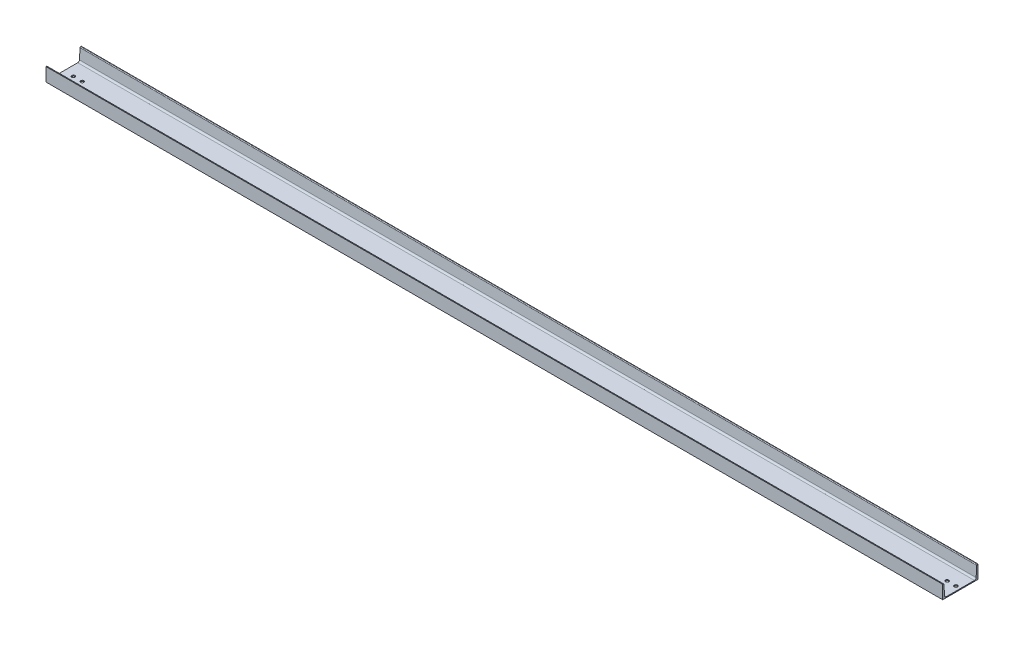
ISO-10303-21;
HEADER;
FILE_DESCRIPTION(('STEP AP214'),'2;1');
FILE_NAME('part.step','',(''),(''),'','','');
FILE_SCHEMA(('AUTOMOTIVE_DESIGN { 1 0 10303 214 1 1 1 1 }'));
ENDSEC;
DATA;
#1=APPLICATION_CONTEXT('core data for automotive mechanical design processes');
#2=APPLICATION_PROTOCOL_DEFINITION('international standard','automotive_design',2000,#1);
#3=PRODUCT_CONTEXT('',#1,'mechanical');
#4=PRODUCT('Part','Part','',(#3));
#5=PRODUCT_RELATED_PRODUCT_CATEGORY('part','',(#4));
#6=PRODUCT_DEFINITION_FORMATION('','',#4);
#7=PRODUCT_DEFINITION_CONTEXT('part definition',#1,'design');
#8=PRODUCT_DEFINITION('design','',#6,#7);
#9=PRODUCT_DEFINITION_SHAPE('','',#8);
#10=(LENGTH_UNIT() NAMED_UNIT(*) SI_UNIT(.MILLI.,.METRE.));
#11=(NAMED_UNIT(*) PLANE_ANGLE_UNIT() SI_UNIT($,.RADIAN.));
#12=(NAMED_UNIT(*) SI_UNIT($,.STERADIAN.) SOLID_ANGLE_UNIT());
#13=UNCERTAINTY_MEASURE_WITH_UNIT(LENGTH_MEASURE(1.E-05),#10,'distance_accuracy_value','');
#14=(GEOMETRIC_REPRESENTATION_CONTEXT(3) GLOBAL_UNCERTAINTY_ASSIGNED_CONTEXT((#13)) GLOBAL_UNIT_ASSIGNED_CONTEXT((#10,
#11,#12)) REPRESENTATION_CONTEXT('',''));
#15=CARTESIAN_POINT('',(0.,0.,0.));
#16=DIRECTION('',(0.,0.,1.));
#17=DIRECTION('',(1.,0.,0.));
#18=AXIS2_PLACEMENT_3D('',#15,#16,#17);
#19=CARTESIAN_POINT('',(5080.,51.3,-96.8911935316379));
#20=DIRECTION('',(-1.,0.,0.));
#21=DIRECTION('',(0.,0.,1.));
#22=AXIS2_PLACEMENT_3D('',#19,#20,#21);
#23=CYLINDRICAL_SURFACE('',#22,4.);
#24=CARTESIAN_POINT('',(0.,51.3,-96.8911935316379));
#25=DIRECTION('',(1.,0.,0.));
#26=DIRECTION('',(0.,0.,1.));
#27=AXIS2_PLACEMENT_3D('',#24,#25,#26);
#28=CIRCLE('',#27,4.);
#29=CARTESIAN_POINT('',(0.,55.3,-96.8911935316379));
#30=VERTEX_POINT('',#29);
#31=CARTESIAN_POINT('',(0.,51.5395691629118,-92.8983741497748));
#32=VERTEX_POINT('',#31);
#33=EDGE_CURVE('E193',#30,#32,#28,.T.);
#34=ORIENTED_EDGE('',*,*,#33,.T.);
#35=DIRECTION('',(-1.,0.,0.));
#36=VECTOR('',#35,1.);
#37=CARTESIAN_POINT('',(5080.,51.5395691629118,-92.8983741497748));
#38=LINE('',#37,#36);
#39=CARTESIAN_POINT('',(5080.,51.5395691629118,-92.8983741497748));
#40=VERTEX_POINT('',#39);
#41=EDGE_CURVE('E13',#40,#32,#38,.T.);
#42=ORIENTED_EDGE('',*,*,#41,.F.);
#43=CARTESIAN_POINT('',(5080.,51.3,-96.8911935316379));
#44=DIRECTION('',(1.,0.,0.));
#45=DIRECTION('',(0.,0.,1.));
#46=AXIS2_PLACEMENT_3D('',#43,#44,#45);
#47=CIRCLE('',#46,4.);
#48=CARTESIAN_POINT('',(5080.,55.3,-96.8911935316379));
#49=VERTEX_POINT('',#48);
#50=EDGE_CURVE('E216',#49,#40,#47,.T.);
#51=ORIENTED_EDGE('',*,*,#50,.F.);
#52=DIRECTION('',(-1.,0.,0.));
#53=VECTOR('',#52,1.);
#54=CARTESIAN_POINT('',(5080.,55.3,-96.8911935316379));
#55=LINE('',#54,#53);
#56=EDGE_CURVE('E189',#49,#30,#55,.T.);
#57=ORIENTED_EDGE('',*,*,#56,.T.);
#58=EDGE_LOOP('',(#34,#42,#51,#57));
#59=FACE_BOUND('',#58,.T.);
#60=ADVANCED_FACE('F73',(#59),#23,.T.);
#61=CARTESIAN_POINT('',(5080.,-6.56897676191552,-89.411861394285));
#62=DIRECTION('',(0.,-0.0598922907279498,-0.998204845465778));
#63=DIRECTION('',(0.,0.998204845465778,-0.0598922907279498));
#64=AXIS2_PLACEMENT_3D('',#61,#62,#63);
#65=PLANE('',#64);
#66=DIRECTION('',(0.,-0.998204845465778,0.0598922907279498));
#67=VECTOR('',#66,1.);
#68=CARTESIAN_POINT('',(0.,-6.56897676191552,-89.411861394285));
#69=LINE('',#68,#67);
#70=CARTESIAN_POINT('',(0.,-6.56897676191553,-89.411861394285));
#71=VERTEX_POINT('',#70);
#72=EDGE_CURVE('E196',#32,#71,#69,.T.);
#73=ORIENTED_EDGE('',*,*,#72,.T.);
#74=DIRECTION('',(-1.,0.,0.));
#75=VECTOR('',#74,1.);
#76=CARTESIAN_POINT('',(5080.,-6.56897676191553,-89.411861394285));
#77=LINE('',#76,#75);
#78=CARTESIAN_POINT('',(5080.,-6.56897676191553,-89.411861394285));
#79=VERTEX_POINT('',#78);
#80=EDGE_CURVE('E81',#79,#71,#77,.T.);
#81=ORIENTED_EDGE('',*,*,#80,.F.);
#82=DIRECTION('',(0.,-0.998204845465778,0.0598922907279498));
#83=VECTOR('',#82,1.);
#84=CARTESIAN_POINT('',(5080.,-6.56897676191552,-89.411861394285));
#85=LINE('',#84,#83);
#86=EDGE_CURVE('E144',#40,#79,#85,.T.);
#87=ORIENTED_EDGE('',*,*,#86,.F.);
#88=ORIENTED_EDGE('',*,*,#41,.T.);
#89=EDGE_LOOP('',(#73,#81,#87,#88));
#90=FACE_BOUND('',#89,.T.);
#91=ADVANCED_FACE('F294',(#90),#65,.F.);
#92=CARTESIAN_POINT('',(5080.,-6.,-79.9289153623601));
#93=DIRECTION('',(-1.,0.,0.));
#94=DIRECTION('',(0.,0.,1.));
#95=AXIS2_PLACEMENT_3D('',#92,#93,#94);
#96=CYLINDRICAL_SURFACE('',#95,9.5);
#97=CARTESIAN_POINT('',(0.,-6.,-79.9289153623601));
#98=DIRECTION('',(-1.,0.,0.));
#99=DIRECTION('',(0.,0.,-1.));
#100=AXIS2_PLACEMENT_3D('',#97,#98,#99);
#101=CIRCLE('',#100,9.5);
#102=CARTESIAN_POINT('',(0.,-15.5,-79.9289153623601));
#103=VERTEX_POINT('',#102);
#104=EDGE_CURVE('E199',#71,#103,#101,.T.);
#105=ORIENTED_EDGE('',*,*,#104,.T.);
#106=DIRECTION('',(-1.,0.,0.));
#107=VECTOR('',#106,1.);
#108=CARTESIAN_POINT('',(5080.,-15.5,-79.9289153623601));
#109=LINE('',#108,#107);
#110=CARTESIAN_POINT('',(5080.,-15.5,-79.9289153623601));
#111=VERTEX_POINT('',#110);
#112=EDGE_CURVE('E235',#111,#103,#109,.T.);
#113=ORIENTED_EDGE('',*,*,#112,.F.);
#114=CARTESIAN_POINT('',(5080.,-6.,-79.9289153623601));
#115=DIRECTION('',(-1.,0.,0.));
#116=DIRECTION('',(0.,0.,-1.));
#117=AXIS2_PLACEMENT_3D('',#114,#115,#116);
#118=CIRCLE('',#117,9.5);
#119=EDGE_CURVE('E243',#79,#111,#118,.T.);
#120=ORIENTED_EDGE('',*,*,#119,.F.);
#121=ORIENTED_EDGE('',*,*,#80,.T.);
#122=EDGE_LOOP('',(#105,#113,#120,#121));
#123=FACE_BOUND('',#122,.T.);
#124=ADVANCED_FACE('F241',(#123),#96,.F.);
#125=CARTESIAN_POINT('',(5080.,-15.5,-79.9289153623601));
#126=DIRECTION('',(0.,-1.,0.));
#127=DIRECTION('',(0.,0.,-1.));
#128=AXIS2_PLACEMENT_3D('',#125,#126,#127);
#129=PLANE('',#128);
#130=CARTESIAN_POINT('',(55.,-15.5,0.));
#131=DIRECTION('',(0.,-1.,0.));
#132=DIRECTION('',(0.,0.,-1.));
#133=AXIS2_PLACEMENT_3D('',#130,#131,#132);
#134=CIRCLE('',#133,8.99999999999999);
#135=CARTESIAN_POINT('',(55.,-15.5,-8.99999999999999));
#136=VERTEX_POINT('',#135);
#137=EDGE_CURVE('E197',#136,#136,#134,.T.);
#138=ORIENTED_EDGE('',*,*,#137,.T.);
#139=EDGE_LOOP('',(#138));
#140=FACE_BOUND('',#139,.T.);
#141=CARTESIAN_POINT('',(105.,-15.5,0.));
#142=DIRECTION('',(0.,-1.,0.));
#143=DIRECTION('',(0.,0.,-1.));
#144=AXIS2_PLACEMENT_3D('',#141,#142,#143);
#145=CIRCLE('',#144,8.99999999999998);
#146=CARTESIAN_POINT('',(105.,-15.5,-8.99999999999998));
#147=VERTEX_POINT('',#146);
#148=EDGE_CURVE('E350',#147,#147,#145,.T.);
#149=ORIENTED_EDGE('',*,*,#148,.T.);
#150=EDGE_LOOP('',(#149));
#151=FACE_BOUND('',#150,.T.);
#152=CARTESIAN_POINT('',(5005.,-15.5,0.));
#153=DIRECTION('',(0.,-1.,0.));
#154=DIRECTION('',(0.,0.,-1.));
#155=AXIS2_PLACEMENT_3D('',#152,#153,#154);
#156=CIRCLE('',#155,9.00000000000049);
#157=CARTESIAN_POINT('',(5005.,-15.5,-9.00000000000049));
#158=VERTEX_POINT('',#157);
#159=EDGE_CURVE('E347',#158,#158,#156,.T.);
#160=ORIENTED_EDGE('',*,*,#159,.T.);
#161=EDGE_LOOP('',(#160));
#162=FACE_BOUND('',#161,.T.);
#163=CARTESIAN_POINT('',(5055.,-15.5,0.));
#164=DIRECTION('',(0.,-1.,0.));
#165=DIRECTION('',(0.,0.,-1.));
#166=AXIS2_PLACEMENT_3D('',#163,#164,#165);
#167=CIRCLE('',#166,9.00000000000049);
#168=CARTESIAN_POINT('',(5055.,-15.5,-9.00000000000049));
#169=VERTEX_POINT('',#168);
#170=EDGE_CURVE('E344',#169,#169,#167,.T.);
#171=ORIENTED_EDGE('',*,*,#170,.T.);
#172=EDGE_LOOP('',(#171));
#173=FACE_BOUND('',#172,.T.);
#174=DIRECTION('',(0.,0.,1.));
#175=VECTOR('',#174,1.);
#176=CARTESIAN_POINT('',(0.,-15.5,-79.9289153623601));
#177=LINE('',#176,#175);
#178=CARTESIAN_POINT('',(0.,-15.5,79.9289153623601));
#179=VERTEX_POINT('',#178);
#180=EDGE_CURVE('E201',#103,#179,#177,.T.);
#181=ORIENTED_EDGE('',*,*,#180,.T.);
#182=DIRECTION('',(-1.,0.,0.));
#183=VECTOR('',#182,1.);
#184=CARTESIAN_POINT('',(5080.,-15.5,79.9289153623601));
#185=LINE('',#184,#183);
#186=CARTESIAN_POINT('',(5080.,-15.5,79.9289153623601));
#187=VERTEX_POINT('',#186);
#188=EDGE_CURVE('E232',#187,#179,#185,.T.);
#189=ORIENTED_EDGE('',*,*,#188,.F.);
#190=DIRECTION('',(0.,0.,1.));
#191=VECTOR('',#190,1.);
#192=CARTESIAN_POINT('',(5080.,-15.5,-79.9289153623601));
#193=LINE('',#192,#191);
#194=EDGE_CURVE('E261',#111,#187,#193,.T.);
#195=ORIENTED_EDGE('',*,*,#194,.F.);
#196=ORIENTED_EDGE('',*,*,#112,.T.);
#197=EDGE_LOOP('',(#181,#189,#195,#196));
#198=FACE_BOUND('',#197,.T.);
#199=ADVANCED_FACE('F252',(#140,#151,#162,#173,#198),#129,.F.);
#200=CARTESIAN_POINT('',(5080.,-6.00000000000002,79.9289153623601));
#201=DIRECTION('',(-1.,0.,0.));
#202=DIRECTION('',(0.,0.,1.));
#203=AXIS2_PLACEMENT_3D('',#200,#201,#202);
#204=CYLINDRICAL_SURFACE('',#203,9.5);
#205=CARTESIAN_POINT('',(0.,-6.00000000000002,79.9289153623601));
#206=DIRECTION('',(-1.,0.,0.));
#207=DIRECTION('',(0.,0.,1.));
#208=AXIS2_PLACEMENT_3D('',#205,#206,#207);
#209=CIRCLE('',#208,9.5);
#210=CARTESIAN_POINT('',(0.,-6.56897676191554,89.411861394285));
#211=VERTEX_POINT('',#210);
#212=EDGE_CURVE('E203',#179,#211,#209,.T.);
#213=ORIENTED_EDGE('',*,*,#212,.T.);
#214=DIRECTION('',(-1.,0.,0.));
#215=VECTOR('',#214,1.);
#216=CARTESIAN_POINT('',(5080.,-6.56897676191554,89.411861394285));
#217=LINE('',#216,#215);
#218=CARTESIAN_POINT('',(5080.,-6.56897676191554,89.411861394285));
#219=VERTEX_POINT('',#218);
#220=EDGE_CURVE('E229',#219,#211,#217,.T.);
#221=ORIENTED_EDGE('',*,*,#220,.F.);
#222=CARTESIAN_POINT('',(5080.,-6.00000000000002,79.9289153623601));
#223=DIRECTION('',(-1.,0.,0.));
#224=DIRECTION('',(0.,0.,1.));
#225=AXIS2_PLACEMENT_3D('',#222,#223,#224);
#226=CIRCLE('',#225,9.5);
#227=EDGE_CURVE('E258',#187,#219,#226,.T.);
#228=ORIENTED_EDGE('',*,*,#227,.F.);
#229=ORIENTED_EDGE('',*,*,#188,.T.);
#230=EDGE_LOOP('',(#213,#221,#228,#229));
#231=FACE_BOUND('',#230,.T.);
#232=ADVANCED_FACE('F256',(#231),#204,.F.);
#233=CARTESIAN_POINT('',(5080.,-6.56897676191554,89.411861394285));
#234=DIRECTION('',(0.,-0.0598922907279498,0.998204845465778));
#235=DIRECTION('',(0.,-0.998204845465778,-0.0598922907279498));
#236=AXIS2_PLACEMENT_3D('',#233,#234,#235);
#237=PLANE('',#236);
#238=DIRECTION('',(0.,0.998204845465778,0.0598922907279498));
#239=VECTOR('',#238,1.);
#240=CARTESIAN_POINT('',(0.,-6.56897676191554,89.411861394285));
#241=LINE('',#240,#239);
#242=CARTESIAN_POINT('',(0.,51.5395691629118,92.8983741497748));
#243=VERTEX_POINT('',#242);
#244=EDGE_CURVE('E205',#211,#243,#241,.T.);
#245=ORIENTED_EDGE('',*,*,#244,.T.);
#246=DIRECTION('',(-1.,0.,0.));
#247=VECTOR('',#246,1.);
#248=CARTESIAN_POINT('',(5080.,51.5395691629118,92.8983741497748));
#249=LINE('',#248,#247);
#250=CARTESIAN_POINT('',(5080.,51.5395691629118,92.8983741497748));
#251=VERTEX_POINT('',#250);
#252=EDGE_CURVE('E226',#251,#243,#249,.T.);
#253=ORIENTED_EDGE('',*,*,#252,.F.);
#254=DIRECTION('',(0.,0.998204845465778,0.0598922907279498));
#255=VECTOR('',#254,1.);
#256=CARTESIAN_POINT('',(5080.,-6.56897676191554,89.411861394285));
#257=LINE('',#256,#255);
#258=EDGE_CURVE('E260',#219,#251,#257,.T.);
#259=ORIENTED_EDGE('',*,*,#258,.F.);
#260=ORIENTED_EDGE('',*,*,#220,.T.);
#261=EDGE_LOOP('',(#245,#253,#259,#260));
#262=FACE_BOUND('',#261,.T.);
#263=ADVANCED_FACE('F308',(#262),#237,.F.);
#264=CARTESIAN_POINT('',(5080.,51.3,96.8911935316379));
#265=DIRECTION('',(-1.,0.,0.));
#266=DIRECTION('',(0.,0.,1.));
#267=AXIS2_PLACEMENT_3D('',#264,#265,#266);
#268=CYLINDRICAL_SURFACE('',#267,4.);
#269=CARTESIAN_POINT('',(0.,51.3,96.8911935316379));
#270=DIRECTION('',(1.,0.,0.));
#271=DIRECTION('',(0.,0.,-1.));
#272=AXIS2_PLACEMENT_3D('',#269,#270,#271);
#273=CIRCLE('',#272,4.);
#274=CARTESIAN_POINT('',(0.,55.3,96.8911935316379));
#275=VERTEX_POINT('',#274);
#276=EDGE_CURVE('E207',#243,#275,#273,.T.);
#277=ORIENTED_EDGE('',*,*,#276,.T.);
#278=DIRECTION('',(-1.,0.,0.));
#279=VECTOR('',#278,1.);
#280=CARTESIAN_POINT('',(5080.,55.3,96.8911935316379));
#281=LINE('',#280,#279);
#282=CARTESIAN_POINT('',(5080.,55.3,96.8911935316379));
#283=VERTEX_POINT('',#282);
#284=EDGE_CURVE('E223',#283,#275,#281,.T.);
#285=ORIENTED_EDGE('',*,*,#284,.F.);
#286=CARTESIAN_POINT('',(5080.,51.3,96.8911935316379));
#287=DIRECTION('',(1.,0.,0.));
#288=DIRECTION('',(0.,0.,-1.));
#289=AXIS2_PLACEMENT_3D('',#286,#287,#288);
#290=CIRCLE('',#289,4.);
#291=EDGE_CURVE('E263',#251,#283,#290,.T.);
#292=ORIENTED_EDGE('',*,*,#291,.F.);
#293=ORIENTED_EDGE('',*,*,#252,.T.);
#294=EDGE_LOOP('',(#277,#285,#292,#293));
#295=FACE_BOUND('',#294,.T.);
#296=ADVANCED_FACE('F311',(#295),#268,.T.);
#297=CARTESIAN_POINT('',(5080.,55.3,96.8911935316379));
#298=DIRECTION('',(0.,-1.,0.));
#299=DIRECTION('',(0.,0.,-1.));
#300=AXIS2_PLACEMENT_3D('',#297,#298,#299);
#301=PLANE('',#300);
#302=DIRECTION('',(0.,0.,1.));
#303=VECTOR('',#302,1.);
#304=CARTESIAN_POINT('',(0.,55.3,96.8911935316379));
#305=LINE('',#304,#303);
#306=CARTESIAN_POINT('',(0.,55.3,100.));
#307=VERTEX_POINT('',#306);
#308=EDGE_CURVE('E209',#275,#307,#305,.T.);
#309=ORIENTED_EDGE('',*,*,#308,.T.);
#310=DIRECTION('',(-1.,0.,0.));
#311=VECTOR('',#310,1.);
#312=CARTESIAN_POINT('',(5080.,55.3,100.));
#313=LINE('',#312,#311);
#314=CARTESIAN_POINT('',(5080.,55.3,100.));
#315=VERTEX_POINT('',#314);
#316=EDGE_CURVE('E220',#315,#307,#313,.T.);
#317=ORIENTED_EDGE('',*,*,#316,.F.);
#318=DIRECTION('',(0.,0.,1.));
#319=VECTOR('',#318,1.);
#320=CARTESIAN_POINT('',(5080.,55.3,96.8911935316379));
#321=LINE('',#320,#319);
#322=EDGE_CURVE('E269',#283,#315,#321,.T.);
#323=ORIENTED_EDGE('',*,*,#322,.F.);
#324=ORIENTED_EDGE('',*,*,#284,.T.);
#325=EDGE_LOOP('',(#309,#317,#323,#324));
#326=FACE_BOUND('',#325,.T.);
#327=ADVANCED_FACE('F275',(#326),#301,.F.);
#328=CARTESIAN_POINT('',(5080.,-20.7,100.));
#329=DIRECTION('',(0.,0.,-1.));
#330=DIRECTION('',(-1.,0.,0.));
#331=AXIS2_PLACEMENT_3D('',#328,#329,#330);
#332=PLANE('',#331);
#333=DIRECTION('',(0.,-1.,0.));
#334=VECTOR('',#333,1.);
#335=CARTESIAN_POINT('',(0.,-20.7,100.));
#336=LINE('',#335,#334);
#337=CARTESIAN_POINT('',(0.,-20.7,100.));
#338=VERTEX_POINT('',#337);
#339=EDGE_CURVE('E211',#307,#338,#336,.T.);
#340=ORIENTED_EDGE('',*,*,#339,.T.);
#341=DIRECTION('',(-1.,0.,0.));
#342=VECTOR('',#341,1.);
#343=CARTESIAN_POINT('',(5080.,-20.7,100.));
#344=LINE('',#343,#342);
#345=CARTESIAN_POINT('',(5080.,-20.7,100.));
#346=VERTEX_POINT('',#345);
#347=EDGE_CURVE('E184',#346,#338,#344,.T.);
#348=ORIENTED_EDGE('',*,*,#347,.F.);
#349=DIRECTION('',(0.,-1.,0.));
#350=VECTOR('',#349,1.);
#351=CARTESIAN_POINT('',(5080.,-20.7,100.));
#352=LINE('',#351,#350);
#353=EDGE_CURVE('E175',#315,#346,#352,.T.);
#354=ORIENTED_EDGE('',*,*,#353,.F.);
#355=ORIENTED_EDGE('',*,*,#316,.T.);
#356=EDGE_LOOP('',(#340,#348,#354,#355));
#357=FACE_BOUND('',#356,.T.);
#358=ADVANCED_FACE('F279',(#357),#332,.F.);
#359=CARTESIAN_POINT('',(5080.,-20.7,100.));
#360=DIRECTION('',(0.,1.,0.));
#361=DIRECTION('',(0.,0.,1.));
#362=AXIS2_PLACEMENT_3D('',#359,#360,#361);
#363=PLANE('',#362);
#364=CARTESIAN_POINT('',(55.,-20.7,0.));
#365=DIRECTION('',(0.,-1.,0.));
#366=DIRECTION('',(0.,0.,-1.));
#367=AXIS2_PLACEMENT_3D('',#364,#365,#366);
#368=CIRCLE('',#367,8.99999999999999);
#369=CARTESIAN_POINT('',(55.,-20.7,-8.99999999999999));
#370=VERTEX_POINT('',#369);
#371=EDGE_CURVE('E327',#370,#370,#368,.T.);
#372=ORIENTED_EDGE('',*,*,#371,.F.);
#373=EDGE_LOOP('',(#372));
#374=FACE_BOUND('',#373,.T.);
#375=CARTESIAN_POINT('',(105.,-20.7,0.));
#376=DIRECTION('',(0.,-1.,0.));
#377=DIRECTION('',(0.,0.,-1.));
#378=AXIS2_PLACEMENT_3D('',#375,#376,#377);
#379=CIRCLE('',#378,8.99999999999998);
#380=CARTESIAN_POINT('',(105.,-20.7,-8.99999999999998));
#381=VERTEX_POINT('',#380);
#382=EDGE_CURVE('E331',#381,#381,#379,.T.);
#383=ORIENTED_EDGE('',*,*,#382,.F.);
#384=EDGE_LOOP('',(#383));
#385=FACE_BOUND('',#384,.T.);
#386=CARTESIAN_POINT('',(5005.,-20.7,0.));
#387=DIRECTION('',(0.,-1.,0.));
#388=DIRECTION('',(0.,0.,-1.));
#389=AXIS2_PLACEMENT_3D('',#386,#387,#388);
#390=CIRCLE('',#389,9.00000000000049);
#391=CARTESIAN_POINT('',(5005.,-20.7,-9.00000000000049));
#392=VERTEX_POINT('',#391);
#393=EDGE_CURVE('E335',#392,#392,#390,.T.);
#394=ORIENTED_EDGE('',*,*,#393,.F.);
#395=EDGE_LOOP('',(#394));
#396=FACE_BOUND('',#395,.T.);
#397=CARTESIAN_POINT('',(5055.,-20.7,0.));
#398=DIRECTION('',(0.,-1.,0.));
#399=DIRECTION('',(0.,0.,-1.));
#400=AXIS2_PLACEMENT_3D('',#397,#398,#399);
#401=CIRCLE('',#400,9.00000000000049);
#402=CARTESIAN_POINT('',(5055.,-20.7,-9.00000000000049));
#403=VERTEX_POINT('',#402);
#404=EDGE_CURVE('E338',#403,#403,#401,.T.);
#405=ORIENTED_EDGE('',*,*,#404,.F.);
#406=EDGE_LOOP('',(#405));
#407=FACE_BOUND('',#406,.T.);
#408=DIRECTION('',(0.,0.,-1.));
#409=VECTOR('',#408,1.);
#410=CARTESIAN_POINT('',(0.,-20.7,100.));
#411=LINE('',#410,#409);
#412=CARTESIAN_POINT('',(0.,-20.7,-100.));
#413=VERTEX_POINT('',#412);
#414=EDGE_CURVE('E183',#338,#413,#411,.T.);
#415=ORIENTED_EDGE('',*,*,#414,.T.);
#416=DIRECTION('',(-1.,0.,0.));
#417=VECTOR('',#416,1.);
#418=CARTESIAN_POINT('',(5080.,-20.7,-100.));
#419=LINE('',#418,#417);
#420=CARTESIAN_POINT('',(5080.,-20.7,-100.));
#421=VERTEX_POINT('',#420);
#422=EDGE_CURVE('E180',#421,#413,#419,.T.);
#423=ORIENTED_EDGE('',*,*,#422,.F.);
#424=DIRECTION('',(0.,0.,-1.));
#425=VECTOR('',#424,1.);
#426=CARTESIAN_POINT('',(5080.,-20.7,100.));
#427=LINE('',#426,#425);
#428=EDGE_CURVE('E169',#346,#421,#427,.T.);
#429=ORIENTED_EDGE('',*,*,#428,.F.);
#430=ORIENTED_EDGE('',*,*,#347,.T.);
#431=EDGE_LOOP('',(#415,#423,#429,#430));
#432=FACE_BOUND('',#431,.T.);
#433=ADVANCED_FACE('F181',(#374,#385,#396,#407,#432),#363,.F.);
#434=CARTESIAN_POINT('',(5080.,-20.7,-100.));
#435=DIRECTION('',(0.,0.,1.));
#436=DIRECTION('',(1.,0.,0.));
#437=AXIS2_PLACEMENT_3D('',#434,#435,#436);
#438=PLANE('',#437);
#439=DIRECTION('',(0.,1.,0.));
#440=VECTOR('',#439,1.);
#441=CARTESIAN_POINT('',(0.,-20.7,-100.));
#442=LINE('',#441,#440);
#443=CARTESIAN_POINT('',(0.,55.3,-100.));
#444=VERTEX_POINT('',#443);
#445=EDGE_CURVE('E130',#413,#444,#442,.T.);
#446=ORIENTED_EDGE('',*,*,#445,.T.);
#447=DIRECTION('',(-1.,0.,0.));
#448=VECTOR('',#447,1.);
#449=CARTESIAN_POINT('',(5080.,55.3,-100.));
#450=LINE('',#449,#448);
#451=CARTESIAN_POINT('',(5080.,55.3,-100.));
#452=VERTEX_POINT('',#451);
#453=EDGE_CURVE('E185',#452,#444,#450,.T.);
#454=ORIENTED_EDGE('',*,*,#453,.F.);
#455=DIRECTION('',(0.,1.,0.));
#456=VECTOR('',#455,1.);
#457=CARTESIAN_POINT('',(5080.,-20.7,-100.));
#458=LINE('',#457,#456);
#459=EDGE_CURVE('E173',#421,#452,#458,.T.);
#460=ORIENTED_EDGE('',*,*,#459,.F.);
#461=ORIENTED_EDGE('',*,*,#422,.T.);
#462=EDGE_LOOP('',(#446,#454,#460,#461));
#463=FACE_BOUND('',#462,.T.);
#464=ADVANCED_FACE('F187',(#463),#438,.F.);
#465=CARTESIAN_POINT('',(5080.,55.3,-96.8911935316379));
#466=DIRECTION('',(0.,-1.,0.));
#467=DIRECTION('',(0.,0.,-1.));
#468=AXIS2_PLACEMENT_3D('',#465,#466,#467);
#469=PLANE('',#468);
#470=DIRECTION('',(0.,0.,1.));
#471=VECTOR('',#470,1.);
#472=CARTESIAN_POINT('',(0.,55.3,-96.8911935316379));
#473=LINE('',#472,#471);
#474=EDGE_CURVE('E136',#444,#30,#473,.T.);
#475=ORIENTED_EDGE('',*,*,#474,.T.);
#476=ORIENTED_EDGE('',*,*,#56,.F.);
#477=DIRECTION('',(0.,0.,1.));
#478=VECTOR('',#477,1.);
#479=CARTESIAN_POINT('',(5080.,55.3,-96.8911935316379));
#480=LINE('',#479,#478);
#481=EDGE_CURVE('E89',#452,#49,#480,.T.);
#482=ORIENTED_EDGE('',*,*,#481,.F.);
#483=ORIENTED_EDGE('',*,*,#453,.T.);
#484=EDGE_LOOP('',(#475,#476,#482,#483));
#485=FACE_BOUND('',#484,.T.);
#486=ADVANCED_FACE('F283',(#485),#469,.F.);
#487=CARTESIAN_POINT('',(5080.,51.3,-96.8911935316379));
#488=DIRECTION('',(-1.,0.,0.));
#489=DIRECTION('',(0.,0.,1.));
#490=AXIS2_PLACEMENT_3D('',#487,#488,#489);
#491=PLANE('',#490);
#492=ORIENTED_EDGE('',*,*,#50,.T.);
#493=ORIENTED_EDGE('',*,*,#86,.T.);
#494=ORIENTED_EDGE('',*,*,#119,.T.);
#495=ORIENTED_EDGE('',*,*,#194,.T.);
#496=ORIENTED_EDGE('',*,*,#227,.T.);
#497=ORIENTED_EDGE('',*,*,#258,.T.);
#498=ORIENTED_EDGE('',*,*,#291,.T.);
#499=ORIENTED_EDGE('',*,*,#322,.T.);
#500=ORIENTED_EDGE('',*,*,#353,.T.);
#501=ORIENTED_EDGE('',*,*,#428,.T.);
#502=ORIENTED_EDGE('',*,*,#459,.T.);
#503=ORIENTED_EDGE('',*,*,#481,.T.);
#504=EDGE_LOOP('',(#492,#493,#494,#495,#496,#497,#498,#499,#500,#501,#502,#503));
#505=FACE_BOUND('',#504,.T.);
#506=ADVANCED_FACE('F171',(#505),#491,.F.);
#507=CARTESIAN_POINT('',(0.,51.3,-96.8911935316379));
#508=DIRECTION('',(-1.,0.,0.));
#509=DIRECTION('',(0.,0.,1.));
#510=AXIS2_PLACEMENT_3D('',#507,#508,#509);
#511=PLANE('',#510);
#512=ORIENTED_EDGE('',*,*,#33,.F.);
#513=ORIENTED_EDGE('',*,*,#474,.F.);
#514=ORIENTED_EDGE('',*,*,#445,.F.);
#515=ORIENTED_EDGE('',*,*,#414,.F.);
#516=ORIENTED_EDGE('',*,*,#339,.F.);
#517=ORIENTED_EDGE('',*,*,#308,.F.);
#518=ORIENTED_EDGE('',*,*,#276,.F.);
#519=ORIENTED_EDGE('',*,*,#244,.F.);
#520=ORIENTED_EDGE('',*,*,#212,.F.);
#521=ORIENTED_EDGE('',*,*,#180,.F.);
#522=ORIENTED_EDGE('',*,*,#104,.F.);
#523=ORIENTED_EDGE('',*,*,#72,.F.);
#524=EDGE_LOOP('',(#512,#513,#514,#515,#516,#517,#518,#519,#520,#521,#522,#523));
#525=FACE_BOUND('',#524,.T.);
#526=ADVANCED_FACE('F247',(#525),#511,.T.);
#527=CARTESIAN_POINT('',(5055.,-10.7,0.));
#528=DIRECTION('',(0.,-1.,0.));
#529=DIRECTION('',(0.,0.,-1.));
#530=AXIS2_PLACEMENT_3D('',#527,#528,#529);
#531=CYLINDRICAL_SURFACE('',#530,9.00000000000049);
#532=ORIENTED_EDGE('',*,*,#404,.T.);
#533=EDGE_LOOP('',(#532));
#534=FACE_BOUND('',#533,.T.);
#535=ORIENTED_EDGE('',*,*,#170,.F.);
#536=EDGE_LOOP('',(#535));
#537=FACE_BOUND('',#536,.T.);
#538=ADVANCED_FACE('F373',(#534,#537),#531,.F.);
#539=CARTESIAN_POINT('',(5005.,-10.7,0.));
#540=DIRECTION('',(0.,-1.,0.));
#541=DIRECTION('',(0.,0.,-1.));
#542=AXIS2_PLACEMENT_3D('',#539,#540,#541);
#543=CYLINDRICAL_SURFACE('',#542,9.00000000000049);
#544=ORIENTED_EDGE('',*,*,#393,.T.);
#545=EDGE_LOOP('',(#544));
#546=FACE_BOUND('',#545,.T.);
#547=ORIENTED_EDGE('',*,*,#159,.F.);
#548=EDGE_LOOP('',(#547));
#549=FACE_BOUND('',#548,.T.);
#550=ADVANCED_FACE('F367',(#546,#549),#543,.F.);
#551=CARTESIAN_POINT('',(105.,-10.7,0.));
#552=DIRECTION('',(0.,-1.,0.));
#553=DIRECTION('',(0.,0.,-1.));
#554=AXIS2_PLACEMENT_3D('',#551,#552,#553);
#555=CYLINDRICAL_SURFACE('',#554,8.99999999999998);
#556=ORIENTED_EDGE('',*,*,#382,.T.);
#557=EDGE_LOOP('',(#556));
#558=FACE_BOUND('',#557,.T.);
#559=ORIENTED_EDGE('',*,*,#148,.F.);
#560=EDGE_LOOP('',(#559));
#561=FACE_BOUND('',#560,.T.);
#562=ADVANCED_FACE('F361',(#558,#561),#555,.F.);
#563=CARTESIAN_POINT('',(55.,-10.7,0.));
#564=DIRECTION('',(0.,-1.,0.));
#565=DIRECTION('',(0.,0.,-1.));
#566=AXIS2_PLACEMENT_3D('',#563,#564,#565);
#567=CYLINDRICAL_SURFACE('',#566,8.99999999999999);
#568=ORIENTED_EDGE('',*,*,#371,.T.);
#569=EDGE_LOOP('',(#568));
#570=FACE_BOUND('',#569,.T.);
#571=ORIENTED_EDGE('',*,*,#137,.F.);
#572=EDGE_LOOP('',(#571));
#573=FACE_BOUND('',#572,.T.);
#574=ADVANCED_FACE('F359',(#570,#573),#567,.F.);
#575=CLOSED_SHELL('',(#60,#91,#124,#199,#232,#263,#296,#327,#358,#433,#464,#486,#506,#526,#538,
#550,#562,#574));
#576=MANIFOLD_SOLID_BREP('B2',#575);
#577=ADVANCED_BREP_SHAPE_REPRESENTATION('',(#18,#576),#14);
#578=SHAPE_DEFINITION_REPRESENTATION(#9,#577);
ENDSEC;
END-ISO-10303-21;
